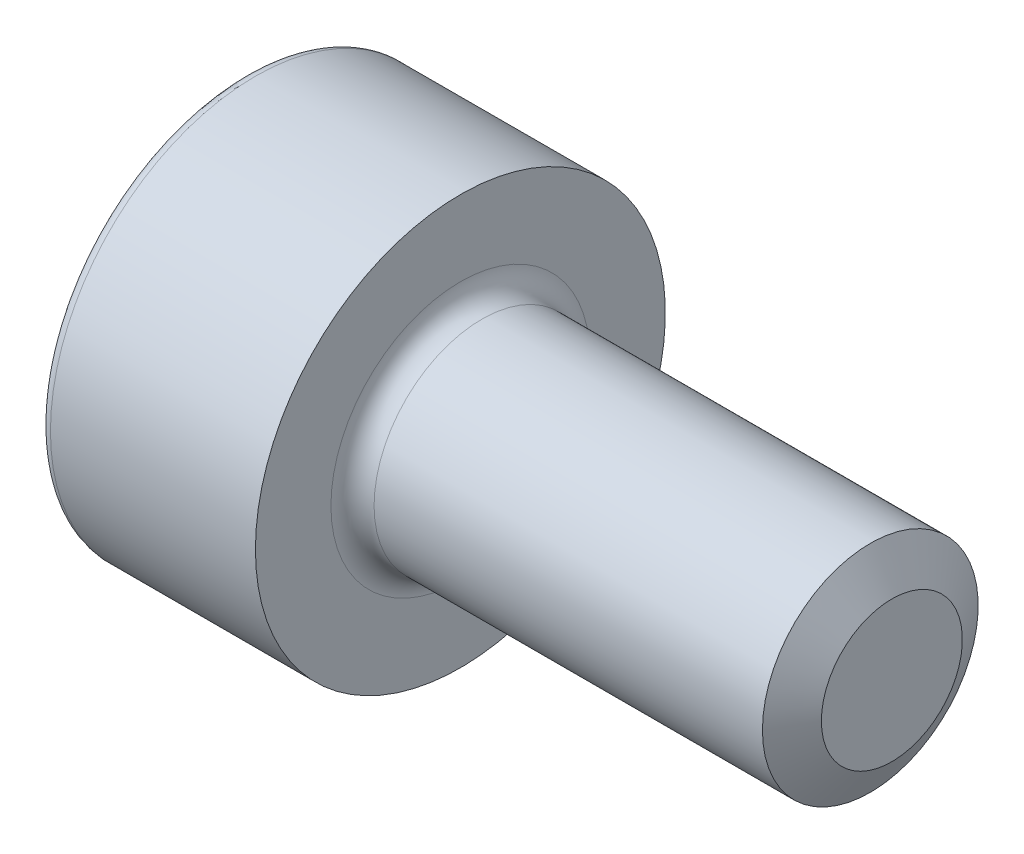
ISO-10303-21;
HEADER;
FILE_DESCRIPTION(('STEP AP214'),'2;1');
FILE_NAME('part.step','',(''),(''),'','','');
FILE_SCHEMA(('AUTOMOTIVE_DESIGN { 1 0 10303 214 1 1 1 1 }'));
ENDSEC;
DATA;
#1=APPLICATION_CONTEXT('core data for automotive mechanical design processes');
#2=APPLICATION_PROTOCOL_DEFINITION('international standard','automotive_design',2000,#1);
#3=PRODUCT_CONTEXT('',#1,'mechanical');
#4=PRODUCT('Part','Part','',(#3));
#5=PRODUCT_RELATED_PRODUCT_CATEGORY('part','',(#4));
#6=PRODUCT_DEFINITION_FORMATION('','',#4);
#7=PRODUCT_DEFINITION_CONTEXT('part definition',#1,'design');
#8=PRODUCT_DEFINITION('design','',#6,#7);
#9=PRODUCT_DEFINITION_SHAPE('','',#8);
#10=(LENGTH_UNIT() NAMED_UNIT(*) SI_UNIT(.MILLI.,.METRE.));
#11=(NAMED_UNIT(*) PLANE_ANGLE_UNIT() SI_UNIT($,.RADIAN.));
#12=(NAMED_UNIT(*) SI_UNIT($,.STERADIAN.) SOLID_ANGLE_UNIT());
#13=UNCERTAINTY_MEASURE_WITH_UNIT(LENGTH_MEASURE(1.E-05),#10,'distance_accuracy_value','');
#14=(GEOMETRIC_REPRESENTATION_CONTEXT(3) GLOBAL_UNCERTAINTY_ASSIGNED_CONTEXT((#13)) GLOBAL_UNIT_ASSIGNED_CONTEXT((#10,
#11,#12)) REPRESENTATION_CONTEXT('',''));
#15=CARTESIAN_POINT('',(0.,0.,0.));
#16=DIRECTION('',(0.,0.,1.));
#17=DIRECTION('',(1.,0.,0.));
#18=AXIS2_PLACEMENT_3D('',#15,#16,#17);
#19=CARTESIAN_POINT('',(0.,0.,0.));
#20=DIRECTION('',(-1.,0.,0.));
#21=DIRECTION('',(0.,0.,1.));
#22=AXIS2_PLACEMENT_3D('',#19,#20,#21);
#23=CYLINDRICAL_SURFACE('',#22,1.);
#24=CARTESIAN_POINT('',(2.2,0.,0.));
#25=DIRECTION('',(-1.,0.,0.));
#26=DIRECTION('',(0.,0.,1.));
#27=AXIS2_PLACEMENT_3D('',#24,#25,#26);
#28=CIRCLE('',#27,1.);
#29=CARTESIAN_POINT('',(2.2,0.,1.));
#30=VERTEX_POINT('',#29);
#31=EDGE_CURVE('E114',#30,#30,#28,.T.);
#32=ORIENTED_EDGE('',*,*,#31,.F.);
#33=EDGE_LOOP('',(#32));
#34=FACE_BOUND('',#33,.T.);
#35=CARTESIAN_POINT('',(5.80000586675271,0.,0.));
#36=DIRECTION('',(-1.,0.,0.));
#37=DIRECTION('',(0.,0.,1.));
#38=AXIS2_PLACEMENT_3D('',#35,#36,#37);
#39=CIRCLE('',#38,1.);
#40=CARTESIAN_POINT('',(5.80000586675271,0.,1.));
#41=VERTEX_POINT('',#40);
#42=EDGE_CURVE('E296',#41,#41,#39,.T.);
#43=ORIENTED_EDGE('',*,*,#42,.T.);
#44=EDGE_LOOP('',(#43));
#45=FACE_BOUND('',#44,.T.);
#46=ADVANCED_FACE('F38',(#34,#45),#23,.T.);
#47=CARTESIAN_POINT('',(0.,0.,0.));
#48=DIRECTION('',(1.,0.,0.));
#49=DIRECTION('',(0.,0.,-1.));
#50=AXIS2_PLACEMENT_3D('',#47,#48,#49);
#51=PLANE('',#50);
#52=CARTESIAN_POINT('',(0.,0.,0.));
#53=DIRECTION('',(1.,0.,0.));
#54=DIRECTION('',(0.,0.,-1.));
#55=AXIS2_PLACEMENT_3D('',#52,#53,#54);
#56=CIRCLE('',#55,1.8);
#57=CARTESIAN_POINT('',(0.,0.,-1.8));
#58=VERTEX_POINT('',#57);
#59=EDGE_CURVE('E46',#58,#58,#56,.F.);
#60=ORIENTED_EDGE('',*,*,#59,.T.);
#61=EDGE_LOOP('',(#60));
#62=FACE_BOUND('',#61,.T.);
#63=DIRECTION('',(0.,0.866025403784439,-0.5));
#64=VECTOR('',#63,1.);
#65=CARTESIAN_POINT('',(0.,0.,0.865));
#66=LINE('',#65,#64);
#67=CARTESIAN_POINT('',(0.,0.,0.865));
#68=VERTEX_POINT('',#67);
#69=CARTESIAN_POINT('',(0.,0.749111974273539,0.4325));
#70=VERTEX_POINT('',#69);
#71=EDGE_CURVE('E329',#68,#70,#66,.T.);
#72=ORIENTED_EDGE('',*,*,#71,.F.);
#73=DIRECTION('',(0.,0.866025403784439,0.5));
#74=VECTOR('',#73,1.);
#75=CARTESIAN_POINT('',(0.,-0.749111974273539,0.4325));
#76=LINE('',#75,#74);
#77=CARTESIAN_POINT('',(0.,-0.749111974273539,0.4325));
#78=VERTEX_POINT('',#77);
#79=EDGE_CURVE('E53',#78,#68,#76,.T.);
#80=ORIENTED_EDGE('',*,*,#79,.F.);
#81=DIRECTION('',(0.,0.,1.));
#82=VECTOR('',#81,1.);
#83=CARTESIAN_POINT('',(0.,-0.749111974273539,-0.4325));
#84=LINE('',#83,#82);
#85=CARTESIAN_POINT('',(0.,-0.749111974273539,-0.4325));
#86=VERTEX_POINT('',#85);
#87=EDGE_CURVE('E89',#86,#78,#84,.T.);
#88=ORIENTED_EDGE('',*,*,#87,.F.);
#89=DIRECTION('',(0.,-0.866025403784439,0.5));
#90=VECTOR('',#89,1.);
#91=CARTESIAN_POINT('',(0.,0.,-0.865));
#92=LINE('',#91,#90);
#93=CARTESIAN_POINT('',(0.,0.,-0.865));
#94=VERTEX_POINT('',#93);
#95=EDGE_CURVE('E97',#94,#86,#92,.T.);
#96=ORIENTED_EDGE('',*,*,#95,.F.);
#97=DIRECTION('',(0.,-0.866025403784439,-0.5));
#98=VECTOR('',#97,1.);
#99=CARTESIAN_POINT('',(0.,0.749111974273539,-0.4325));
#100=LINE('',#99,#98);
#101=CARTESIAN_POINT('',(0.,0.749111974273539,-0.4325));
#102=VERTEX_POINT('',#101);
#103=EDGE_CURVE('E103',#102,#94,#100,.T.);
#104=ORIENTED_EDGE('',*,*,#103,.F.);
#105=DIRECTION('',(0.,0.,-1.));
#106=VECTOR('',#105,1.);
#107=CARTESIAN_POINT('',(0.,0.749111974273539,0.4325));
#108=LINE('',#107,#106);
#109=EDGE_CURVE('E332',#70,#102,#108,.T.);
#110=ORIENTED_EDGE('',*,*,#109,.F.);
#111=EDGE_LOOP('',(#72,#80,#88,#96,#104,#110));
#112=FACE_BOUND('',#111,.T.);
#113=ADVANCED_FACE('F106',(#62,#112),#51,.F.);
#114=CARTESIAN_POINT('',(0.,0.,0.));
#115=DIRECTION('',(-1.,0.,0.));
#116=DIRECTION('',(0.,0.,1.));
#117=AXIS2_PLACEMENT_3D('',#114,#115,#116);
#118=CYLINDRICAL_SURFACE('',#117,1.9);
#119=CARTESIAN_POINT('',(0.1,0.,0.));
#120=DIRECTION('',(1.,0.,0.));
#121=DIRECTION('',(0.,0.,-1.));
#122=AXIS2_PLACEMENT_3D('',#119,#120,#121);
#123=CIRCLE('',#122,1.9);
#124=CARTESIAN_POINT('',(0.1,0.,-1.9));
#125=VERTEX_POINT('',#124);
#126=EDGE_CURVE('E11',#125,#125,#123,.T.);
#127=ORIENTED_EDGE('',*,*,#126,.T.);
#128=EDGE_LOOP('',(#127));
#129=FACE_BOUND('',#128,.T.);
#130=CARTESIAN_POINT('',(2.,0.,0.));
#131=DIRECTION('',(-1.,0.,0.));
#132=DIRECTION('',(0.,0.,1.));
#133=AXIS2_PLACEMENT_3D('',#130,#131,#132);
#134=CIRCLE('',#133,1.9);
#135=CARTESIAN_POINT('',(2.,0.,1.9));
#136=VERTEX_POINT('',#135);
#137=EDGE_CURVE('E128',#136,#136,#134,.T.);
#138=ORIENTED_EDGE('',*,*,#137,.T.);
#139=EDGE_LOOP('',(#138));
#140=FACE_BOUND('',#139,.T.);
#141=ADVANCED_FACE('F151',(#129,#140),#118,.T.);
#142=CARTESIAN_POINT('',(2.,1.9,0.));
#143=DIRECTION('',(-1.,0.,0.));
#144=DIRECTION('',(0.,0.,1.));
#145=AXIS2_PLACEMENT_3D('',#142,#143,#144);
#146=PLANE('',#145);
#147=ORIENTED_EDGE('',*,*,#137,.F.);
#148=EDGE_LOOP('',(#147));
#149=FACE_BOUND('',#148,.T.);
#150=CARTESIAN_POINT('',(2.,0.,0.));
#151=DIRECTION('',(-1.,0.,0.));
#152=DIRECTION('',(0.,0.,1.));
#153=AXIS2_PLACEMENT_3D('',#150,#151,#152);
#154=CIRCLE('',#153,1.2);
#155=CARTESIAN_POINT('',(2.,0.,1.2));
#156=VERTEX_POINT('',#155);
#157=EDGE_CURVE('E125',#156,#156,#154,.T.);
#158=ORIENTED_EDGE('',*,*,#157,.T.);
#159=EDGE_LOOP('',(#158));
#160=FACE_BOUND('',#159,.T.);
#161=ADVANCED_FACE('F160',(#149,#160),#146,.F.);
#162=CARTESIAN_POINT('',(2.2,0.,0.));
#163=DIRECTION('',(-1.,0.,0.));
#164=DIRECTION('',(0.,0.,1.));
#165=AXIS2_PLACEMENT_3D('',#162,#163,#164);
#166=TOROIDAL_SURFACE('',#165,1.2,0.2);
#167=ORIENTED_EDGE('',*,*,#157,.F.);
#168=EDGE_LOOP('',(#167));
#169=FACE_BOUND('',#168,.T.);
#170=ORIENTED_EDGE('',*,*,#31,.T.);
#171=EDGE_LOOP('',(#170));
#172=FACE_BOUND('',#171,.T.);
#173=ADVANCED_FACE('F156',(#169,#172),#166,.F.);
#174=CARTESIAN_POINT('',(1.,-0.749111974273539,0.4325));
#175=DIRECTION('',(0.,-0.5,0.866025403784439));
#176=DIRECTION('',(0.,-0.866025403784439,-0.5));
#177=AXIS2_PLACEMENT_3D('',#174,#175,#176);
#178=PLANE('',#177);
#179=ORIENTED_EDGE('',*,*,#79,.T.);
#180=DIRECTION('',(-1.,0.,0.));
#181=VECTOR('',#180,1.);
#182=CARTESIAN_POINT('',(1.,0.,0.865));
#183=LINE('',#182,#181);
#184=CARTESIAN_POINT('',(1.,0.,0.865));
#185=VERTEX_POINT('',#184);
#186=EDGE_CURVE('E121',#185,#68,#183,.T.);
#187=ORIENTED_EDGE('',*,*,#186,.F.);
#188=DIRECTION('',(0.,0.866025403784439,0.5));
#189=VECTOR('',#188,1.);
#190=CARTESIAN_POINT('',(1.,-0.749111974273539,0.4325));
#191=LINE('',#190,#189);
#192=CARTESIAN_POINT('',(1.,-0.749111974273539,0.4325));
#193=VERTEX_POINT('',#192);
#194=EDGE_CURVE('E107',#193,#185,#191,.T.);
#195=ORIENTED_EDGE('',*,*,#194,.F.);
#196=DIRECTION('',(-1.,0.,0.));
#197=VECTOR('',#196,1.);
#198=CARTESIAN_POINT('',(1.,-0.749111974273539,0.4325));
#199=LINE('',#198,#197);
#200=EDGE_CURVE('E93',#193,#78,#199,.T.);
#201=ORIENTED_EDGE('',*,*,#200,.T.);
#202=EDGE_LOOP('',(#179,#187,#195,#201));
#203=FACE_BOUND('',#202,.T.);
#204=ADVANCED_FACE('F159',(#203),#178,.F.);
#205=CARTESIAN_POINT('',(1.,-0.749111974273539,-0.4325));
#206=DIRECTION('',(0.,-1.,0.));
#207=DIRECTION('',(0.,0.,-1.));
#208=AXIS2_PLACEMENT_3D('',#205,#206,#207);
#209=PLANE('',#208);
#210=ORIENTED_EDGE('',*,*,#87,.T.);
#211=ORIENTED_EDGE('',*,*,#200,.F.);
#212=DIRECTION('',(0.,0.,1.));
#213=VECTOR('',#212,1.);
#214=CARTESIAN_POINT('',(1.,-0.749111974273539,-0.4325));
#215=LINE('',#214,#213);
#216=CARTESIAN_POINT('',(1.,-0.749111974273539,-0.4325));
#217=VERTEX_POINT('',#216);
#218=EDGE_CURVE('E90',#217,#193,#215,.T.);
#219=ORIENTED_EDGE('',*,*,#218,.F.);
#220=DIRECTION('',(-1.,0.,0.));
#221=VECTOR('',#220,1.);
#222=CARTESIAN_POINT('',(1.,-0.749111974273539,-0.4325));
#223=LINE('',#222,#221);
#224=EDGE_CURVE('E84',#217,#86,#223,.T.);
#225=ORIENTED_EDGE('',*,*,#224,.T.);
#226=EDGE_LOOP('',(#210,#211,#219,#225));
#227=FACE_BOUND('',#226,.T.);
#228=ADVANCED_FACE('F86',(#227),#209,.F.);
#229=CARTESIAN_POINT('',(1.,0.,-0.865));
#230=DIRECTION('',(0.,-0.5,-0.866025403784439));
#231=DIRECTION('',(0.,0.866025403784439,-0.5));
#232=AXIS2_PLACEMENT_3D('',#229,#230,#231);
#233=PLANE('',#232);
#234=ORIENTED_EDGE('',*,*,#95,.T.);
#235=ORIENTED_EDGE('',*,*,#224,.F.);
#236=DIRECTION('',(0.,-0.866025403784439,0.5));
#237=VECTOR('',#236,1.);
#238=CARTESIAN_POINT('',(1.,0.,-0.865));
#239=LINE('',#238,#237);
#240=CARTESIAN_POINT('',(1.,0.,-0.865));
#241=VERTEX_POINT('',#240);
#242=EDGE_CURVE('E325',#241,#217,#239,.T.);
#243=ORIENTED_EDGE('',*,*,#242,.F.);
#244=DIRECTION('',(-1.,0.,0.));
#245=VECTOR('',#244,1.);
#246=CARTESIAN_POINT('',(1.,0.,-0.865));
#247=LINE('',#246,#245);
#248=EDGE_CURVE('E94',#241,#94,#247,.T.);
#249=ORIENTED_EDGE('',*,*,#248,.T.);
#250=EDGE_LOOP('',(#234,#235,#243,#249));
#251=FACE_BOUND('',#250,.T.);
#252=ADVANCED_FACE('F98',(#251),#233,.F.);
#253=CARTESIAN_POINT('',(1.,0.749111974273539,-0.4325));
#254=DIRECTION('',(0.,0.5,-0.866025403784439));
#255=DIRECTION('',(0.,0.866025403784439,0.5));
#256=AXIS2_PLACEMENT_3D('',#253,#254,#255);
#257=PLANE('',#256);
#258=ORIENTED_EDGE('',*,*,#103,.T.);
#259=ORIENTED_EDGE('',*,*,#248,.F.);
#260=DIRECTION('',(0.,-0.866025403784439,-0.5));
#261=VECTOR('',#260,1.);
#262=CARTESIAN_POINT('',(1.,0.749111974273539,-0.4325));
#263=LINE('',#262,#261);
#264=CARTESIAN_POINT('',(1.,0.749111974273539,-0.4325));
#265=VERTEX_POINT('',#264);
#266=EDGE_CURVE('E322',#265,#241,#263,.T.);
#267=ORIENTED_EDGE('',*,*,#266,.F.);
#268=DIRECTION('',(-1.,0.,0.));
#269=VECTOR('',#268,1.);
#270=CARTESIAN_POINT('',(1.,0.749111974273539,-0.4325));
#271=LINE('',#270,#269);
#272=EDGE_CURVE('E117',#265,#102,#271,.T.);
#273=ORIENTED_EDGE('',*,*,#272,.T.);
#274=EDGE_LOOP('',(#258,#259,#267,#273));
#275=FACE_BOUND('',#274,.T.);
#276=ADVANCED_FACE('F201',(#275),#257,.F.);
#277=CARTESIAN_POINT('',(1.,0.749111974273539,0.4325));
#278=DIRECTION('',(0.,1.,0.));
#279=DIRECTION('',(0.,0.,1.));
#280=AXIS2_PLACEMENT_3D('',#277,#278,#279);
#281=PLANE('',#280);
#282=ORIENTED_EDGE('',*,*,#109,.T.);
#283=ORIENTED_EDGE('',*,*,#272,.F.);
#284=DIRECTION('',(0.,0.,-1.));
#285=VECTOR('',#284,1.);
#286=CARTESIAN_POINT('',(1.,0.749111974273539,0.4325));
#287=LINE('',#286,#285);
#288=CARTESIAN_POINT('',(1.,0.749111974273539,0.4325));
#289=VERTEX_POINT('',#288);
#290=EDGE_CURVE('E319',#289,#265,#287,.T.);
#291=ORIENTED_EDGE('',*,*,#290,.F.);
#292=DIRECTION('',(-1.,0.,0.));
#293=VECTOR('',#292,1.);
#294=CARTESIAN_POINT('',(1.,0.749111974273539,0.4325));
#295=LINE('',#294,#293);
#296=EDGE_CURVE('E119',#289,#70,#295,.T.);
#297=ORIENTED_EDGE('',*,*,#296,.T.);
#298=EDGE_LOOP('',(#282,#283,#291,#297));
#299=FACE_BOUND('',#298,.T.);
#300=ADVANCED_FACE('F208',(#299),#281,.F.);
#301=CARTESIAN_POINT('',(1.,0.,0.865));
#302=DIRECTION('',(0.,0.5,0.866025403784439));
#303=DIRECTION('',(0.,-0.866025403784439,0.5));
#304=AXIS2_PLACEMENT_3D('',#301,#302,#303);
#305=PLANE('',#304);
#306=ORIENTED_EDGE('',*,*,#71,.T.);
#307=ORIENTED_EDGE('',*,*,#296,.F.);
#308=DIRECTION('',(0.,0.866025403784439,-0.5));
#309=VECTOR('',#308,1.);
#310=CARTESIAN_POINT('',(1.,0.,0.865));
#311=LINE('',#310,#309);
#312=EDGE_CURVE('E110',#185,#289,#311,.T.);
#313=ORIENTED_EDGE('',*,*,#312,.F.);
#314=ORIENTED_EDGE('',*,*,#186,.T.);
#315=EDGE_LOOP('',(#306,#307,#313,#314));
#316=FACE_BOUND('',#315,.T.);
#317=ADVANCED_FACE('F216',(#316),#305,.F.);
#318=CARTESIAN_POINT('',(1.,-0.749111974273539,-0.4325));
#319=DIRECTION('',(-0.996035719954435,0.0444770856027303,0.0770365720365191));
#320=DIRECTION('',(0.0771128825766104,0.,0.997022368525765));
#321=AXIS2_PLACEMENT_3D('',#318,#319,#320);
#322=PLANE('',#321);
#323=DIRECTION('',(-0.0771128825766104,-0.863446699284643,-0.498511184262883));
#324=VECTOR('',#323,1.);
#325=CARTESIAN_POINT('',(1.06690185249043,0.,0.));
#326=LINE('',#325,#324);
#327=CARTESIAN_POINT('',(1.06690185249043,0.,0.));
#328=VERTEX_POINT('',#327);
#329=EDGE_CURVE('E62',#328,#217,#326,.T.);
#330=ORIENTED_EDGE('',*,*,#329,.F.);
#331=DIRECTION('',(-0.0771128825766104,0.,-0.997022368525765));
#332=VECTOR('',#331,1.);
#333=CARTESIAN_POINT('',(1.06690185249043,0.,0.));
#334=LINE('',#333,#332);
#335=EDGE_CURVE('E305',#328,#241,#334,.T.);
#336=ORIENTED_EDGE('',*,*,#335,.T.);
#337=ORIENTED_EDGE('',*,*,#242,.T.);
#338=EDGE_LOOP('',(#330,#336,#337));
#339=FACE_BOUND('',#338,.T.);
#340=ADVANCED_FACE('F224',(#339),#322,.T.);
#341=CARTESIAN_POINT('',(1.,0.,-0.865));
#342=DIRECTION('',(-0.996035719954435,-0.0444770856027303,0.0770365720365191));
#343=DIRECTION('',(0.0771128825766104,0.,0.997022368525765));
#344=AXIS2_PLACEMENT_3D('',#341,#342,#343);
#345=PLANE('',#344);
#346=ORIENTED_EDGE('',*,*,#335,.F.);
#347=DIRECTION('',(-0.0771128825766104,0.863446699284643,-0.498511184262882));
#348=VECTOR('',#347,1.);
#349=CARTESIAN_POINT('',(1.06690185249043,0.,0.));
#350=LINE('',#349,#348);
#351=EDGE_CURVE('E309',#328,#265,#350,.T.);
#352=ORIENTED_EDGE('',*,*,#351,.T.);
#353=ORIENTED_EDGE('',*,*,#266,.T.);
#354=EDGE_LOOP('',(#346,#352,#353));
#355=FACE_BOUND('',#354,.T.);
#356=ADVANCED_FACE('F232',(#355),#345,.T.);
#357=CARTESIAN_POINT('',(1.,-0.749111974273539,0.4325));
#358=DIRECTION('',(-0.996035719954435,0.0889541712054606,0.));
#359=DIRECTION('',(-0.0889541712054606,-0.996035719954435,0.));
#360=AXIS2_PLACEMENT_3D('',#357,#358,#359);
#361=PLANE('',#360);
#362=DIRECTION('',(-0.0771128825766104,-0.863446699284643,0.498511184262883));
#363=VECTOR('',#362,1.);
#364=CARTESIAN_POINT('',(1.06690185249043,0.,0.));
#365=LINE('',#364,#363);
#366=EDGE_CURVE('E312',#328,#193,#365,.T.);
#367=ORIENTED_EDGE('',*,*,#366,.F.);
#368=ORIENTED_EDGE('',*,*,#329,.T.);
#369=ORIENTED_EDGE('',*,*,#218,.T.);
#370=EDGE_LOOP('',(#367,#368,#369));
#371=FACE_BOUND('',#370,.T.);
#372=ADVANCED_FACE('F240',(#371),#361,.T.);
#373=CARTESIAN_POINT('',(1.,0.749111974273539,-0.4325));
#374=DIRECTION('',(-0.996035719954435,-0.0889541712054606,0.));
#375=DIRECTION('',(0.0889541712054606,-0.996035719954435,0.));
#376=AXIS2_PLACEMENT_3D('',#373,#374,#375);
#377=PLANE('',#376);
#378=ORIENTED_EDGE('',*,*,#351,.F.);
#379=DIRECTION('',(-0.0771128825766104,0.863446699284643,0.498511184262883));
#380=VECTOR('',#379,1.);
#381=CARTESIAN_POINT('',(1.06690185249043,0.,0.));
#382=LINE('',#381,#380);
#383=EDGE_CURVE('E300',#328,#289,#382,.T.);
#384=ORIENTED_EDGE('',*,*,#383,.T.);
#385=ORIENTED_EDGE('',*,*,#290,.T.);
#386=EDGE_LOOP('',(#378,#384,#385));
#387=FACE_BOUND('',#386,.T.);
#388=ADVANCED_FACE('F248',(#387),#377,.T.);
#389=CARTESIAN_POINT('',(1.,0.,0.865));
#390=DIRECTION('',(-0.996035719954435,0.0444770856027303,-0.0770365720365191));
#391=DIRECTION('',(-0.0771128825766104,0.,0.997022368525765));
#392=AXIS2_PLACEMENT_3D('',#389,#390,#391);
#393=PLANE('',#392);
#394=DIRECTION('',(-0.0771128825766104,0.,0.997022368525765));
#395=VECTOR('',#394,1.);
#396=CARTESIAN_POINT('',(1.06690185249043,0.,0.));
#397=LINE('',#396,#395);
#398=EDGE_CURVE('E295',#328,#185,#397,.T.);
#399=ORIENTED_EDGE('',*,*,#398,.F.);
#400=ORIENTED_EDGE('',*,*,#366,.T.);
#401=ORIENTED_EDGE('',*,*,#194,.T.);
#402=EDGE_LOOP('',(#399,#400,#401));
#403=FACE_BOUND('',#402,.T.);
#404=ADVANCED_FACE('F255',(#403),#393,.T.);
#405=CARTESIAN_POINT('',(1.,0.749111974273539,0.4325));
#406=DIRECTION('',(-0.996035719954435,-0.0444770856027303,-0.077036572036519));
#407=DIRECTION('',(-0.0771128825766104,0.,0.997022368525765));
#408=AXIS2_PLACEMENT_3D('',#405,#406,#407);
#409=PLANE('',#408);
#410=ORIENTED_EDGE('',*,*,#383,.F.);
#411=ORIENTED_EDGE('',*,*,#398,.T.);
#412=ORIENTED_EDGE('',*,*,#312,.T.);
#413=EDGE_LOOP('',(#410,#411,#412));
#414=FACE_BOUND('',#413,.T.);
#415=ADVANCED_FACE('F263',(#414),#409,.T.);
#416=CARTESIAN_POINT('',(5.80000586675271,0.,0.));
#417=DIRECTION('',(-1.,0.,0.));
#418=DIRECTION('',(0.,0.,1.));
#419=AXIS2_PLACEMENT_3D('',#416,#417,#418);
#420=CONICAL_SURFACE('',#419,1.,1.04719755119659);
#421=CARTESIAN_POINT('',(6.,0.,0.));
#422=DIRECTION('',(-1.,0.,0.));
#423=DIRECTION('',(0.,0.,1.));
#424=AXIS2_PLACEMENT_3D('',#421,#422,#423);
#425=CIRCLE('',#424,0.6536);
#426=CARTESIAN_POINT('',(6.,0.,0.6536));
#427=VERTEX_POINT('',#426);
#428=EDGE_CURVE('E292',#427,#427,#425,.T.);
#429=ORIENTED_EDGE('',*,*,#428,.T.);
#430=EDGE_LOOP('',(#429));
#431=FACE_BOUND('',#430,.T.);
#432=ORIENTED_EDGE('',*,*,#42,.F.);
#433=EDGE_LOOP('',(#432));
#434=FACE_BOUND('',#433,.T.);
#435=ADVANCED_FACE('F141',(#431,#434),#420,.T.);
#436=CARTESIAN_POINT('',(6.,1.,0.));
#437=DIRECTION('',(-1.,0.,0.));
#438=DIRECTION('',(0.,0.,1.));
#439=AXIS2_PLACEMENT_3D('',#436,#437,#438);
#440=PLANE('',#439);
#441=ORIENTED_EDGE('',*,*,#428,.F.);
#442=EDGE_LOOP('',(#441));
#443=FACE_BOUND('',#442,.T.);
#444=ADVANCED_FACE('F136',(#443),#440,.F.);
#445=CARTESIAN_POINT('',(0.1,0.,0.));
#446=DIRECTION('',(1.,0.,0.));
#447=DIRECTION('',(0.,0.,-1.));
#448=AXIS2_PLACEMENT_3D('',#445,#446,#447);
#449=TOROIDAL_SURFACE('',#448,1.8,0.1);
#450=ORIENTED_EDGE('',*,*,#126,.F.);
#451=EDGE_LOOP('',(#450));
#452=FACE_BOUND('',#451,.T.);
#453=ORIENTED_EDGE('',*,*,#59,.F.);
#454=EDGE_LOOP('',(#453));
#455=FACE_BOUND('',#454,.T.);
#456=ADVANCED_FACE('F40',(#452,#455),#449,.T.);
#457=CLOSED_SHELL('',(#46,#113,#141,#161,#173,#204,#228,#252,#276,#300,#317,#340,#356,#372,#388,
#404,#415,#435,#444,#456));
#458=MANIFOLD_SOLID_BREP('B2',#457);
#459=ADVANCED_BREP_SHAPE_REPRESENTATION('',(#18,#458),#14);
#460=SHAPE_DEFINITION_REPRESENTATION(#9,#459);
ENDSEC;
END-ISO-10303-21;
